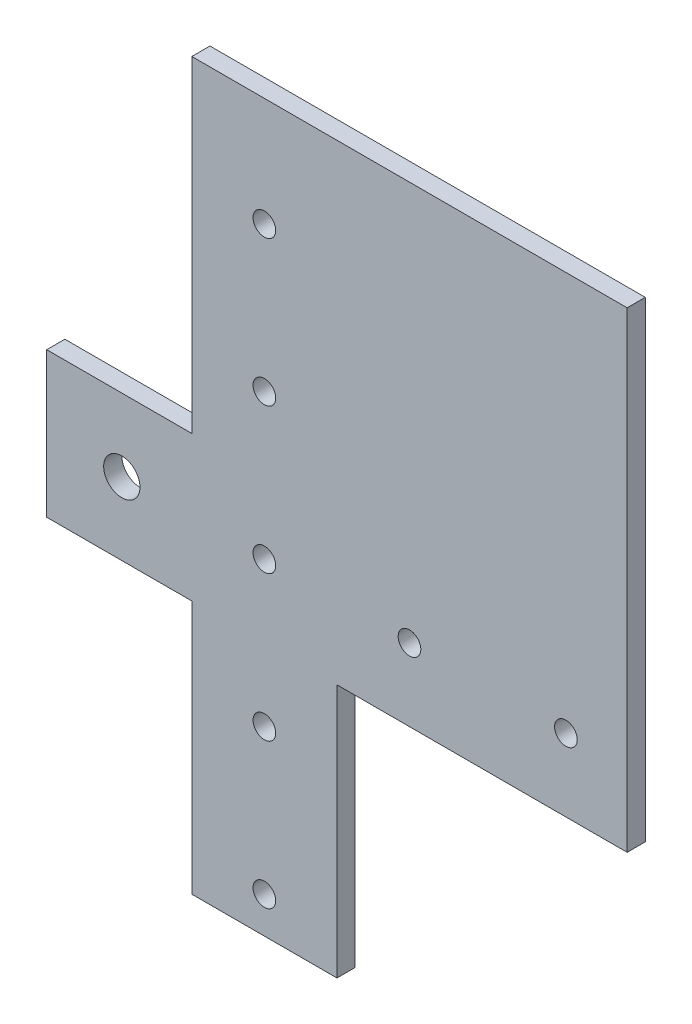
ISO-10303-21;
HEADER;
FILE_DESCRIPTION(('STEP AP214'),'2;1');
FILE_NAME('part.step','',(''),(''),'','','');
FILE_SCHEMA(('AUTOMOTIVE_DESIGN { 1 0 10303 214 1 1 1 1 }'));
ENDSEC;
DATA;
#1=APPLICATION_CONTEXT('core data for automotive mechanical design processes');
#2=APPLICATION_PROTOCOL_DEFINITION('international standard','automotive_design',2000,#1);
#3=PRODUCT_CONTEXT('',#1,'mechanical');
#4=PRODUCT('Part','Part','',(#3));
#5=PRODUCT_RELATED_PRODUCT_CATEGORY('part','',(#4));
#6=PRODUCT_DEFINITION_FORMATION('','',#4);
#7=PRODUCT_DEFINITION_CONTEXT('part definition',#1,'design');
#8=PRODUCT_DEFINITION('design','',#6,#7);
#9=PRODUCT_DEFINITION_SHAPE('','',#8);
#10=(LENGTH_UNIT() NAMED_UNIT(*) SI_UNIT(.MILLI.,.METRE.));
#11=(NAMED_UNIT(*) PLANE_ANGLE_UNIT() SI_UNIT($,.RADIAN.));
#12=(NAMED_UNIT(*) SI_UNIT($,.STERADIAN.) SOLID_ANGLE_UNIT());
#13=UNCERTAINTY_MEASURE_WITH_UNIT(LENGTH_MEASURE(1.E-05),#10,'distance_accuracy_value','');
#14=(GEOMETRIC_REPRESENTATION_CONTEXT(3) GLOBAL_UNCERTAINTY_ASSIGNED_CONTEXT((#13)) GLOBAL_UNIT_ASSIGNED_CONTEXT((#10,
#11,#12)) REPRESENTATION_CONTEXT('',''));
#15=CARTESIAN_POINT('',(0.,0.,0.));
#16=DIRECTION('',(0.,0.,1.));
#17=DIRECTION('',(1.,0.,0.));
#18=AXIS2_PLACEMENT_3D('',#15,#16,#17);
#19=CARTESIAN_POINT('',(0.,-1.78693467336684,3.175));
#20=DIRECTION('',(0.,1.,0.));
#21=DIRECTION('',(0.,0.,1.));
#22=AXIS2_PLACEMENT_3D('',#19,#20,#21);
#23=PLANE('',#22);
#24=DIRECTION('',(1.,0.,0.));
#25=VECTOR('',#24,1.);
#26=CARTESIAN_POINT('',(0.,-1.78693467336684,0.));
#27=LINE('',#26,#25);
#28=CARTESIAN_POINT('',(25.4,-1.78693467336684,0.));
#29=VERTEX_POINT('',#28);
#30=CARTESIAN_POINT('',(50.8,-1.78693467336684,0.));
#31=VERTEX_POINT('',#30);
#32=EDGE_CURVE('E170',#29,#31,#27,.T.);
#33=ORIENTED_EDGE('',*,*,#32,.T.);
#34=DIRECTION('',(0.,0.,-1.));
#35=VECTOR('',#34,1.);
#36=CARTESIAN_POINT('',(50.8,-1.78693467336684,3.175));
#37=LINE('',#36,#35);
#38=CARTESIAN_POINT('',(50.8,-1.78693467336684,3.175));
#39=VERTEX_POINT('',#38);
#40=EDGE_CURVE('E11',#39,#31,#37,.T.);
#41=ORIENTED_EDGE('',*,*,#40,.F.);
#42=DIRECTION('',(1.,0.,0.));
#43=VECTOR('',#42,1.);
#44=CARTESIAN_POINT('',(0.,-1.78693467336684,3.175));
#45=LINE('',#44,#43);
#46=CARTESIAN_POINT('',(25.4,-1.78693467336684,3.175));
#47=VERTEX_POINT('',#46);
#48=EDGE_CURVE('E230',#47,#39,#45,.T.);
#49=ORIENTED_EDGE('',*,*,#48,.F.);
#50=DIRECTION('',(0.,0.,-1.));
#51=VECTOR('',#50,1.);
#52=CARTESIAN_POINT('',(25.4,-1.78693467336684,3.175));
#53=LINE('',#52,#51);
#54=EDGE_CURVE('E52',#47,#29,#53,.T.);
#55=ORIENTED_EDGE('',*,*,#54,.T.);
#56=EDGE_LOOP('',(#33,#41,#49,#55));
#57=FACE_BOUND('',#56,.T.);
#58=ADVANCED_FACE('F35',(#57),#23,.F.);
#59=CARTESIAN_POINT('',(50.8,0.,3.175));
#60=DIRECTION('',(-1.,0.,0.));
#61=DIRECTION('',(0.,0.,1.));
#62=AXIS2_PLACEMENT_3D('',#59,#60,#61);
#63=PLANE('',#62);
#64=DIRECTION('',(0.,1.,0.));
#65=VECTOR('',#64,1.);
#66=CARTESIAN_POINT('',(50.8,0.,0.));
#67=LINE('',#66,#65);
#68=CARTESIAN_POINT('',(50.8,42.6630653266332,0.));
#69=VERTEX_POINT('',#68);
#70=EDGE_CURVE('E172',#31,#69,#67,.T.);
#71=ORIENTED_EDGE('',*,*,#70,.T.);
#72=DIRECTION('',(0.,0.,-1.));
#73=VECTOR('',#72,1.);
#74=CARTESIAN_POINT('',(50.8,42.6630653266332,3.175));
#75=LINE('',#74,#73);
#76=CARTESIAN_POINT('',(50.8,42.6630653266332,3.175));
#77=VERTEX_POINT('',#76);
#78=EDGE_CURVE('E44',#77,#69,#75,.T.);
#79=ORIENTED_EDGE('',*,*,#78,.F.);
#80=DIRECTION('',(0.,1.,0.));
#81=VECTOR('',#80,1.);
#82=CARTESIAN_POINT('',(50.8,0.,3.175));
#83=LINE('',#82,#81);
#84=EDGE_CURVE('E97',#39,#77,#83,.T.);
#85=ORIENTED_EDGE('',*,*,#84,.F.);
#86=ORIENTED_EDGE('',*,*,#40,.T.);
#87=EDGE_LOOP('',(#71,#79,#85,#86));
#88=FACE_BOUND('',#87,.T.);
#89=ADVANCED_FACE('F213',(#88),#63,.F.);
#90=CARTESIAN_POINT('',(0.,42.6630653266332,3.175));
#91=DIRECTION('',(0.,-1.,0.));
#92=DIRECTION('',(0.,0.,-1.));
#93=AXIS2_PLACEMENT_3D('',#90,#91,#92);
#94=PLANE('',#93);
#95=DIRECTION('',(-1.,0.,0.));
#96=VECTOR('',#95,1.);
#97=CARTESIAN_POINT('',(0.,42.6630653266332,0.));
#98=LINE('',#97,#96);
#99=CARTESIAN_POINT('',(101.6,42.6630653266332,0.));
#100=VERTEX_POINT('',#99);
#101=EDGE_CURVE('E175',#100,#69,#98,.T.);
#102=ORIENTED_EDGE('',*,*,#101,.F.);
#103=DIRECTION('',(0.,0.,-1.));
#104=VECTOR('',#103,1.);
#105=CARTESIAN_POINT('',(101.6,42.6630653266332,3.175));
#106=LINE('',#105,#104);
#107=CARTESIAN_POINT('',(101.6,42.6630653266332,3.175));
#108=VERTEX_POINT('',#107);
#109=EDGE_CURVE('E206',#108,#100,#106,.T.);
#110=ORIENTED_EDGE('',*,*,#109,.F.);
#111=DIRECTION('',(-1.,0.,0.));
#112=VECTOR('',#111,1.);
#113=CARTESIAN_POINT('',(0.,42.6630653266332,3.175));
#114=LINE('',#113,#112);
#115=EDGE_CURVE('E212',#108,#77,#114,.T.);
#116=ORIENTED_EDGE('',*,*,#115,.T.);
#117=ORIENTED_EDGE('',*,*,#78,.T.);
#118=EDGE_LOOP('',(#102,#110,#116,#117));
#119=FACE_BOUND('',#118,.T.);
#120=ADVANCED_FACE('F210',(#119),#94,.T.);
#121=CARTESIAN_POINT('',(101.6,0.,3.175));
#122=DIRECTION('',(-1.,0.,0.));
#123=DIRECTION('',(0.,-1.,0.));
#124=AXIS2_PLACEMENT_3D('',#121,#122,#123);
#125=PLANE('',#124);
#126=DIRECTION('',(0.,1.,0.));
#127=VECTOR('',#126,1.);
#128=CARTESIAN_POINT('',(101.6,0.,0.));
#129=LINE('',#128,#127);
#130=CARTESIAN_POINT('',(101.6,125.213065326633,0.));
#131=VERTEX_POINT('',#130);
#132=EDGE_CURVE('E178',#100,#131,#129,.T.);
#133=ORIENTED_EDGE('',*,*,#132,.T.);
#134=DIRECTION('',(0.,0.,-1.));
#135=VECTOR('',#134,1.);
#136=CARTESIAN_POINT('',(101.6,125.213065326633,3.175));
#137=LINE('',#136,#135);
#138=CARTESIAN_POINT('',(101.6,125.213065326633,3.175));
#139=VERTEX_POINT('',#138);
#140=EDGE_CURVE('E204',#139,#131,#137,.T.);
#141=ORIENTED_EDGE('',*,*,#140,.F.);
#142=DIRECTION('',(0.,1.,0.));
#143=VECTOR('',#142,1.);
#144=CARTESIAN_POINT('',(101.6,0.,3.175));
#145=LINE('',#144,#143);
#146=EDGE_CURVE('E225',#108,#139,#145,.T.);
#147=ORIENTED_EDGE('',*,*,#146,.F.);
#148=ORIENTED_EDGE('',*,*,#109,.T.);
#149=EDGE_LOOP('',(#133,#141,#147,#148));
#150=FACE_BOUND('',#149,.T.);
#151=ADVANCED_FACE('F222',(#150),#125,.F.);
#152=CARTESIAN_POINT('',(0.,125.213065326633,3.175));
#153=DIRECTION('',(0.,1.,0.));
#154=DIRECTION('',(0.,0.,1.));
#155=AXIS2_PLACEMENT_3D('',#152,#153,#154);
#156=PLANE('',#155);
#157=DIRECTION('',(1.,0.,0.));
#158=VECTOR('',#157,1.);
#159=CARTESIAN_POINT('',(0.,125.213065326633,0.));
#160=LINE('',#159,#158);
#161=CARTESIAN_POINT('',(25.4,125.213065326633,0.));
#162=VERTEX_POINT('',#161);
#163=EDGE_CURVE('E181',#162,#131,#160,.T.);
#164=ORIENTED_EDGE('',*,*,#163,.F.);
#165=DIRECTION('',(0.,0.,-1.));
#166=VECTOR('',#165,1.);
#167=CARTESIAN_POINT('',(25.4,125.213065326633,3.175));
#168=LINE('',#167,#166);
#169=CARTESIAN_POINT('',(25.4,125.213065326633,3.175));
#170=VERTEX_POINT('',#169);
#171=EDGE_CURVE('E202',#170,#162,#168,.T.);
#172=ORIENTED_EDGE('',*,*,#171,.F.);
#173=DIRECTION('',(1.,0.,0.));
#174=VECTOR('',#173,1.);
#175=CARTESIAN_POINT('',(0.,125.213065326633,3.175));
#176=LINE('',#175,#174);
#177=EDGE_CURVE('E227',#170,#139,#176,.T.);
#178=ORIENTED_EDGE('',*,*,#177,.T.);
#179=ORIENTED_EDGE('',*,*,#140,.T.);
#180=EDGE_LOOP('',(#164,#172,#178,#179));
#181=FACE_BOUND('',#180,.T.);
#182=ADVANCED_FACE('F405',(#181),#156,.T.);
#183=CARTESIAN_POINT('',(25.4,0.,3.175));
#184=DIRECTION('',(1.,0.,0.));
#185=DIRECTION('',(0.,0.,-1.));
#186=AXIS2_PLACEMENT_3D('',#183,#184,#185);
#187=PLANE('',#186);
#188=DIRECTION('',(0.,-1.,0.));
#189=VECTOR('',#188,1.);
#190=CARTESIAN_POINT('',(25.4,0.,0.));
#191=LINE('',#190,#189);
#192=CARTESIAN_POINT('',(25.4,68.0630653266332,0.));
#193=VERTEX_POINT('',#192);
#194=EDGE_CURVE('E184',#162,#193,#191,.T.);
#195=ORIENTED_EDGE('',*,*,#194,.T.);
#196=DIRECTION('',(0.,0.,-1.));
#197=VECTOR('',#196,1.);
#198=CARTESIAN_POINT('',(25.4,68.0630653266332,3.175));
#199=LINE('',#198,#197);
#200=CARTESIAN_POINT('',(25.4,68.0630653266332,3.175));
#201=VERTEX_POINT('',#200);
#202=EDGE_CURVE('E200',#201,#193,#199,.T.);
#203=ORIENTED_EDGE('',*,*,#202,.F.);
#204=DIRECTION('',(0.,-1.,0.));
#205=VECTOR('',#204,1.);
#206=CARTESIAN_POINT('',(25.4,0.,3.175));
#207=LINE('',#206,#205);
#208=EDGE_CURVE('E141',#170,#201,#207,.T.);
#209=ORIENTED_EDGE('',*,*,#208,.F.);
#210=ORIENTED_EDGE('',*,*,#171,.T.);
#211=EDGE_LOOP('',(#195,#203,#209,#210));
#212=FACE_BOUND('',#211,.T.);
#213=ADVANCED_FACE('F237',(#212),#187,.F.);
#214=CARTESIAN_POINT('',(0.,68.0630653266332,3.175));
#215=DIRECTION('',(0.,1.,0.));
#216=DIRECTION('',(0.,0.,1.));
#217=AXIS2_PLACEMENT_3D('',#214,#215,#216);
#218=PLANE('',#217);
#219=DIRECTION('',(1.,0.,0.));
#220=VECTOR('',#219,1.);
#221=CARTESIAN_POINT('',(0.,68.0630653266332,0.));
#222=LINE('',#221,#220);
#223=CARTESIAN_POINT('',(0.,68.0630653266332,0.));
#224=VERTEX_POINT('',#223);
#225=EDGE_CURVE('E187',#224,#193,#222,.T.);
#226=ORIENTED_EDGE('',*,*,#225,.F.);
#227=DIRECTION('',(0.,0.,-1.));
#228=VECTOR('',#227,1.);
#229=CARTESIAN_POINT('',(0.,68.0630653266332,3.175));
#230=LINE('',#229,#228);
#231=CARTESIAN_POINT('',(0.,68.0630653266332,3.175));
#232=VERTEX_POINT('',#231);
#233=EDGE_CURVE('E128',#232,#224,#230,.T.);
#234=ORIENTED_EDGE('',*,*,#233,.F.);
#235=DIRECTION('',(1.,0.,0.));
#236=VECTOR('',#235,1.);
#237=CARTESIAN_POINT('',(0.,68.0630653266332,3.175));
#238=LINE('',#237,#236);
#239=EDGE_CURVE('E139',#232,#201,#238,.T.);
#240=ORIENTED_EDGE('',*,*,#239,.T.);
#241=ORIENTED_EDGE('',*,*,#202,.T.);
#242=EDGE_LOOP('',(#226,#234,#240,#241));
#243=FACE_BOUND('',#242,.T.);
#244=ADVANCED_FACE('F240',(#243),#218,.T.);
#245=CARTESIAN_POINT('',(0.,0.,3.175));
#246=DIRECTION('',(-1.,0.,0.));
#247=DIRECTION('',(0.,-1.,0.));
#248=AXIS2_PLACEMENT_3D('',#245,#246,#247);
#249=PLANE('',#248);
#250=DIRECTION('',(0.,1.,0.));
#251=VECTOR('',#250,1.);
#252=CARTESIAN_POINT('',(0.,0.,0.));
#253=LINE('',#252,#251);
#254=CARTESIAN_POINT('',(0.,42.6630653266332,0.));
#255=VERTEX_POINT('',#254);
#256=EDGE_CURVE('E125',#255,#224,#253,.T.);
#257=ORIENTED_EDGE('',*,*,#256,.F.);
#258=DIRECTION('',(0.,0.,-1.));
#259=VECTOR('',#258,1.);
#260=CARTESIAN_POINT('',(0.,42.6630653266332,3.175));
#261=LINE('',#260,#259);
#262=CARTESIAN_POINT('',(0.,42.6630653266332,3.175));
#263=VERTEX_POINT('',#262);
#264=EDGE_CURVE('E119',#263,#255,#261,.T.);
#265=ORIENTED_EDGE('',*,*,#264,.F.);
#266=DIRECTION('',(0.,1.,0.));
#267=VECTOR('',#266,1.);
#268=CARTESIAN_POINT('',(0.,0.,3.175));
#269=LINE('',#268,#267);
#270=EDGE_CURVE('E123',#263,#232,#269,.T.);
#271=ORIENTED_EDGE('',*,*,#270,.T.);
#272=ORIENTED_EDGE('',*,*,#233,.T.);
#273=EDGE_LOOP('',(#257,#265,#271,#272));
#274=FACE_BOUND('',#273,.T.);
#275=ADVANCED_FACE('F121',(#274),#249,.T.);
#276=CARTESIAN_POINT('',(0.,42.6630653266332,3.175));
#277=DIRECTION('',(0.,1.,0.));
#278=DIRECTION('',(0.,0.,1.));
#279=AXIS2_PLACEMENT_3D('',#276,#277,#278);
#280=PLANE('',#279);
#281=DIRECTION('',(1.,0.,0.));
#282=VECTOR('',#281,1.);
#283=CARTESIAN_POINT('',(0.,42.6630653266332,0.));
#284=LINE('',#283,#282);
#285=CARTESIAN_POINT('',(25.4,42.6630653266332,0.));
#286=VERTEX_POINT('',#285);
#287=EDGE_CURVE('E191',#255,#286,#284,.T.);
#288=ORIENTED_EDGE('',*,*,#287,.T.);
#289=DIRECTION('',(0.,0.,-1.));
#290=VECTOR('',#289,1.);
#291=CARTESIAN_POINT('',(25.4,42.6630653266332,3.175));
#292=LINE('',#291,#290);
#293=CARTESIAN_POINT('',(25.4,42.6630653266332,3.175));
#294=VERTEX_POINT('',#293);
#295=EDGE_CURVE('E85',#294,#286,#292,.T.);
#296=ORIENTED_EDGE('',*,*,#295,.F.);
#297=DIRECTION('',(1.,0.,0.));
#298=VECTOR('',#297,1.);
#299=CARTESIAN_POINT('',(0.,42.6630653266332,3.175));
#300=LINE('',#299,#298);
#301=EDGE_CURVE('E130',#263,#294,#300,.T.);
#302=ORIENTED_EDGE('',*,*,#301,.F.);
#303=ORIENTED_EDGE('',*,*,#264,.T.);
#304=EDGE_LOOP('',(#288,#296,#302,#303));
#305=FACE_BOUND('',#304,.T.);
#306=ADVANCED_FACE('F131',(#305),#280,.F.);
#307=CARTESIAN_POINT('',(38.1,106.163065326633,3.175));
#308=DIRECTION('',(0.,0.,-1.));
#309=DIRECTION('',(-1.,0.,0.));
#310=AXIS2_PLACEMENT_3D('',#307,#308,#309);
#311=CYLINDRICAL_SURFACE('',#310,1.98437499999999);
#312=CARTESIAN_POINT('',(38.1,106.163065326633,3.175));
#313=DIRECTION('',(0.,0.,1.));
#314=DIRECTION('',(1.,0.,0.));
#315=AXIS2_PLACEMENT_3D('',#312,#313,#314);
#316=CIRCLE('',#315,1.98437499999999);
#317=CARTESIAN_POINT('',(40.084375,106.163065326633,3.175));
#318=VERTEX_POINT('',#317);
#319=EDGE_CURVE('E465',#318,#318,#316,.T.);
#320=ORIENTED_EDGE('',*,*,#319,.T.);
#321=EDGE_LOOP('',(#320));
#322=FACE_BOUND('',#321,.T.);
#323=CARTESIAN_POINT('',(38.1,106.163065326633,0.));
#324=DIRECTION('',(0.,0.,1.));
#325=DIRECTION('',(1.,0.,0.));
#326=AXIS2_PLACEMENT_3D('',#323,#324,#325);
#327=CIRCLE('',#326,1.98437499999999);
#328=CARTESIAN_POINT('',(40.084375,106.163065326633,0.));
#329=VERTEX_POINT('',#328);
#330=EDGE_CURVE('E167',#329,#329,#327,.T.);
#331=ORIENTED_EDGE('',*,*,#330,.F.);
#332=EDGE_LOOP('',(#331));
#333=FACE_BOUND('',#332,.T.);
#334=ADVANCED_FACE('F262',(#322,#333),#311,.F.);
#335=CARTESIAN_POINT('',(38.1,80.7630653266332,3.175));
#336=DIRECTION('',(0.,0.,-1.));
#337=DIRECTION('',(-1.,0.,0.));
#338=AXIS2_PLACEMENT_3D('',#335,#336,#337);
#339=CYLINDRICAL_SURFACE('',#338,1.98437499999999);
#340=CARTESIAN_POINT('',(38.1,80.7630653266332,3.175));
#341=DIRECTION('',(0.,0.,1.));
#342=DIRECTION('',(1.,0.,0.));
#343=AXIS2_PLACEMENT_3D('',#340,#341,#342);
#344=CIRCLE('',#343,1.98437499999999);
#345=CARTESIAN_POINT('',(40.084375,80.7630653266332,3.175));
#346=VERTEX_POINT('',#345);
#347=EDGE_CURVE('E462',#346,#346,#344,.T.);
#348=ORIENTED_EDGE('',*,*,#347,.T.);
#349=EDGE_LOOP('',(#348));
#350=FACE_BOUND('',#349,.T.);
#351=CARTESIAN_POINT('',(38.1,80.7630653266332,0.));
#352=DIRECTION('',(0.,0.,1.));
#353=DIRECTION('',(1.,0.,0.));
#354=AXIS2_PLACEMENT_3D('',#351,#352,#353);
#355=CIRCLE('',#354,1.98437499999999);
#356=CARTESIAN_POINT('',(40.084375,80.7630653266332,0.));
#357=VERTEX_POINT('',#356);
#358=EDGE_CURVE('E164',#357,#357,#355,.T.);
#359=ORIENTED_EDGE('',*,*,#358,.F.);
#360=EDGE_LOOP('',(#359));
#361=FACE_BOUND('',#360,.T.);
#362=ADVANCED_FACE('F265',(#350,#361),#339,.F.);
#363=CARTESIAN_POINT('',(38.1,55.3630653266332,3.175));
#364=DIRECTION('',(0.,0.,-1.));
#365=DIRECTION('',(-1.,0.,0.));
#366=AXIS2_PLACEMENT_3D('',#363,#364,#365);
#367=CYLINDRICAL_SURFACE('',#366,1.98437499999999);
#368=CARTESIAN_POINT('',(38.1,55.3630653266332,3.175));
#369=DIRECTION('',(0.,0.,1.));
#370=DIRECTION('',(1.,0.,0.));
#371=AXIS2_PLACEMENT_3D('',#368,#369,#370);
#372=CIRCLE('',#371,1.98437499999999);
#373=CARTESIAN_POINT('',(40.084375,55.3630653266332,3.175));
#374=VERTEX_POINT('',#373);
#375=EDGE_CURVE('E459',#374,#374,#372,.T.);
#376=ORIENTED_EDGE('',*,*,#375,.T.);
#377=EDGE_LOOP('',(#376));
#378=FACE_BOUND('',#377,.T.);
#379=CARTESIAN_POINT('',(38.1,55.3630653266332,0.));
#380=DIRECTION('',(0.,0.,1.));
#381=DIRECTION('',(1.,0.,0.));
#382=AXIS2_PLACEMENT_3D('',#379,#380,#381);
#383=CIRCLE('',#382,1.98437499999999);
#384=CARTESIAN_POINT('',(40.084375,55.3630653266332,0.));
#385=VERTEX_POINT('',#384);
#386=EDGE_CURVE('E161',#385,#385,#383,.T.);
#387=ORIENTED_EDGE('',*,*,#386,.F.);
#388=EDGE_LOOP('',(#387));
#389=FACE_BOUND('',#388,.T.);
#390=ADVANCED_FACE('F269',(#378,#389),#367,.F.);
#391=CARTESIAN_POINT('',(38.1,29.9630653266332,3.175));
#392=DIRECTION('',(0.,0.,-1.));
#393=DIRECTION('',(-1.,0.,0.));
#394=AXIS2_PLACEMENT_3D('',#391,#392,#393);
#395=CYLINDRICAL_SURFACE('',#394,1.98437499999999);
#396=CARTESIAN_POINT('',(38.1,29.9630653266332,3.175));
#397=DIRECTION('',(0.,0.,1.));
#398=DIRECTION('',(1.,0.,0.));
#399=AXIS2_PLACEMENT_3D('',#396,#397,#398);
#400=CIRCLE('',#399,1.98437499999999);
#401=CARTESIAN_POINT('',(40.084375,29.9630653266332,3.175));
#402=VERTEX_POINT('',#401);
#403=EDGE_CURVE('E456',#402,#402,#400,.T.);
#404=ORIENTED_EDGE('',*,*,#403,.T.);
#405=EDGE_LOOP('',(#404));
#406=FACE_BOUND('',#405,.T.);
#407=CARTESIAN_POINT('',(38.1,29.9630653266332,0.));
#408=DIRECTION('',(0.,0.,1.));
#409=DIRECTION('',(1.,0.,0.));
#410=AXIS2_PLACEMENT_3D('',#407,#408,#409);
#411=CIRCLE('',#410,1.98437499999999);
#412=CARTESIAN_POINT('',(40.084375,29.9630653266332,0.));
#413=VERTEX_POINT('',#412);
#414=EDGE_CURVE('E158',#413,#413,#411,.T.);
#415=ORIENTED_EDGE('',*,*,#414,.F.);
#416=EDGE_LOOP('',(#415));
#417=FACE_BOUND('',#416,.T.);
#418=ADVANCED_FACE('F273',(#406,#417),#395,.F.);
#419=CARTESIAN_POINT('',(38.1,4.56306532663316,3.175));
#420=DIRECTION('',(0.,0.,-1.));
#421=DIRECTION('',(-1.,0.,0.));
#422=AXIS2_PLACEMENT_3D('',#419,#420,#421);
#423=CYLINDRICAL_SURFACE('',#422,1.984375);
#424=CARTESIAN_POINT('',(38.1,4.56306532663316,3.175));
#425=DIRECTION('',(0.,0.,1.));
#426=DIRECTION('',(1.,0.,0.));
#427=AXIS2_PLACEMENT_3D('',#424,#425,#426);
#428=CIRCLE('',#427,1.984375);
#429=CARTESIAN_POINT('',(40.084375,4.56306532663316,3.175));
#430=VERTEX_POINT('',#429);
#431=EDGE_CURVE('E449',#430,#430,#428,.T.);
#432=ORIENTED_EDGE('',*,*,#431,.T.);
#433=EDGE_LOOP('',(#432));
#434=FACE_BOUND('',#433,.T.);
#435=CARTESIAN_POINT('',(38.1,4.56306532663316,0.));
#436=DIRECTION('',(0.,0.,1.));
#437=DIRECTION('',(1.,0.,0.));
#438=AXIS2_PLACEMENT_3D('',#435,#436,#437);
#439=CIRCLE('',#438,1.984375);
#440=CARTESIAN_POINT('',(40.084375,4.56306532663316,0.));
#441=VERTEX_POINT('',#440);
#442=EDGE_CURVE('E155',#441,#441,#439,.T.);
#443=ORIENTED_EDGE('',*,*,#442,.F.);
#444=EDGE_LOOP('',(#443));
#445=FACE_BOUND('',#444,.T.);
#446=ADVANCED_FACE('F277',(#434,#445),#423,.F.);
#447=CARTESIAN_POINT('',(63.5,55.3630653266332,3.175));
#448=DIRECTION('',(0.,0.,-1.));
#449=DIRECTION('',(-1.,0.,0.));
#450=AXIS2_PLACEMENT_3D('',#447,#448,#449);
#451=CYLINDRICAL_SURFACE('',#450,1.98437499999999);
#452=CARTESIAN_POINT('',(63.5,55.3630653266332,3.175));
#453=DIRECTION('',(0.,0.,1.));
#454=DIRECTION('',(1.,0.,0.));
#455=AXIS2_PLACEMENT_3D('',#452,#453,#454);
#456=CIRCLE('',#455,1.98437499999999);
#457=CARTESIAN_POINT('',(65.484375,55.3630653266332,3.175));
#458=VERTEX_POINT('',#457);
#459=EDGE_CURVE('E446',#458,#458,#456,.T.);
#460=ORIENTED_EDGE('',*,*,#459,.T.);
#461=EDGE_LOOP('',(#460));
#462=FACE_BOUND('',#461,.T.);
#463=CARTESIAN_POINT('',(63.5,55.3630653266332,0.));
#464=DIRECTION('',(0.,0.,1.));
#465=DIRECTION('',(1.,0.,0.));
#466=AXIS2_PLACEMENT_3D('',#463,#464,#465);
#467=CIRCLE('',#466,1.98437499999999);
#468=CARTESIAN_POINT('',(65.484375,55.3630653266332,0.));
#469=VERTEX_POINT('',#468);
#470=EDGE_CURVE('E152',#469,#469,#467,.T.);
#471=ORIENTED_EDGE('',*,*,#470,.F.);
#472=EDGE_LOOP('',(#471));
#473=FACE_BOUND('',#472,.T.);
#474=ADVANCED_FACE('F281',(#462,#473),#451,.F.);
#475=CARTESIAN_POINT('',(90.884375,55.3630653266332,3.175));
#476=DIRECTION('',(0.,0.,-1.));
#477=DIRECTION('',(-1.,0.,0.));
#478=AXIS2_PLACEMENT_3D('',#475,#476,#477);
#479=CYLINDRICAL_SURFACE('',#478,1.98437499999999);
#480=CARTESIAN_POINT('',(90.884375,55.3630653266332,3.175));
#481=DIRECTION('',(0.,0.,1.));
#482=DIRECTION('',(1.,0.,0.));
#483=AXIS2_PLACEMENT_3D('',#480,#481,#482);
#484=CIRCLE('',#483,1.98437499999999);
#485=CARTESIAN_POINT('',(92.86875,55.3630653266332,3.175));
#486=VERTEX_POINT('',#485);
#487=EDGE_CURVE('E292',#486,#486,#484,.T.);
#488=ORIENTED_EDGE('',*,*,#487,.T.);
#489=EDGE_LOOP('',(#488));
#490=FACE_BOUND('',#489,.T.);
#491=CARTESIAN_POINT('',(90.884375,55.3630653266332,0.));
#492=DIRECTION('',(0.,0.,1.));
#493=DIRECTION('',(1.,0.,0.));
#494=AXIS2_PLACEMENT_3D('',#491,#492,#493);
#495=CIRCLE('',#494,1.98437499999999);
#496=CARTESIAN_POINT('',(92.86875,55.3630653266332,0.));
#497=VERTEX_POINT('',#496);
#498=EDGE_CURVE('E149',#497,#497,#495,.T.);
#499=ORIENTED_EDGE('',*,*,#498,.F.);
#500=EDGE_LOOP('',(#499));
#501=FACE_BOUND('',#500,.T.);
#502=ADVANCED_FACE('F250',(#490,#501),#479,.F.);
#503=CARTESIAN_POINT('',(13.1435536111557,55.3630653266332,3.175));
#504=DIRECTION('',(0.,0.,-1.));
#505=DIRECTION('',(-1.,0.,0.));
#506=AXIS2_PLACEMENT_3D('',#503,#504,#505);
#507=CYLINDRICAL_SURFACE('',#506,3.175);
#508=CARTESIAN_POINT('',(13.1435536111557,55.3630653266332,3.175));
#509=DIRECTION('',(0.,0.,1.));
#510=DIRECTION('',(1.,0.,0.));
#511=AXIS2_PLACEMENT_3D('',#508,#509,#510);
#512=CIRCLE('',#511,3.175);
#513=CARTESIAN_POINT('',(16.3185536111557,55.3630653266332,3.175));
#514=VERTEX_POINT('',#513);
#515=EDGE_CURVE('E196',#514,#514,#512,.T.);
#516=ORIENTED_EDGE('',*,*,#515,.T.);
#517=EDGE_LOOP('',(#516));
#518=FACE_BOUND('',#517,.T.);
#519=CARTESIAN_POINT('',(13.1435536111557,55.3630653266332,0.));
#520=DIRECTION('',(0.,0.,1.));
#521=DIRECTION('',(1.,0.,0.));
#522=AXIS2_PLACEMENT_3D('',#519,#520,#521);
#523=CIRCLE('',#522,3.175);
#524=CARTESIAN_POINT('',(16.3185536111557,55.3630653266332,0.));
#525=VERTEX_POINT('',#524);
#526=EDGE_CURVE('E146',#525,#525,#523,.T.);
#527=ORIENTED_EDGE('',*,*,#526,.F.);
#528=EDGE_LOOP('',(#527));
#529=FACE_BOUND('',#528,.T.);
#530=ADVANCED_FACE('F37',(#518,#529),#507,.F.);
#531=CARTESIAN_POINT('',(25.4,0.,3.175));
#532=DIRECTION('',(-1.,0.,0.));
#533=DIRECTION('',(0.,0.,1.));
#534=AXIS2_PLACEMENT_3D('',#531,#532,#533);
#535=PLANE('',#534);
#536=DIRECTION('',(0.,1.,0.));
#537=VECTOR('',#536,1.);
#538=CARTESIAN_POINT('',(25.4,0.,0.));
#539=LINE('',#538,#537);
#540=EDGE_CURVE('E193',#29,#286,#539,.T.);
#541=ORIENTED_EDGE('',*,*,#540,.F.);
#542=ORIENTED_EDGE('',*,*,#54,.F.);
#543=DIRECTION('',(0.,1.,0.));
#544=VECTOR('',#543,1.);
#545=CARTESIAN_POINT('',(25.4,0.,3.175));
#546=LINE('',#545,#544);
#547=EDGE_CURVE('E134',#47,#294,#546,.T.);
#548=ORIENTED_EDGE('',*,*,#547,.T.);
#549=ORIENTED_EDGE('',*,*,#295,.T.);
#550=EDGE_LOOP('',(#541,#542,#548,#549));
#551=FACE_BOUND('',#550,.T.);
#552=ADVANCED_FACE('F241',(#551),#535,.T.);
#553=CARTESIAN_POINT('',(0.,0.,3.175));
#554=DIRECTION('',(0.,0.,1.));
#555=DIRECTION('',(1.,0.,0.));
#556=AXIS2_PLACEMENT_3D('',#553,#554,#555);
#557=PLANE('',#556);
#558=ORIENTED_EDGE('',*,*,#515,.F.);
#559=EDGE_LOOP('',(#558));
#560=FACE_BOUND('',#559,.T.);
#561=ORIENTED_EDGE('',*,*,#487,.F.);
#562=EDGE_LOOP('',(#561));
#563=FACE_BOUND('',#562,.T.);
#564=ORIENTED_EDGE('',*,*,#459,.F.);
#565=EDGE_LOOP('',(#564));
#566=FACE_BOUND('',#565,.T.);
#567=ORIENTED_EDGE('',*,*,#431,.F.);
#568=EDGE_LOOP('',(#567));
#569=FACE_BOUND('',#568,.T.);
#570=ORIENTED_EDGE('',*,*,#403,.F.);
#571=EDGE_LOOP('',(#570));
#572=FACE_BOUND('',#571,.T.);
#573=ORIENTED_EDGE('',*,*,#375,.F.);
#574=EDGE_LOOP('',(#573));
#575=FACE_BOUND('',#574,.T.);
#576=ORIENTED_EDGE('',*,*,#347,.F.);
#577=EDGE_LOOP('',(#576));
#578=FACE_BOUND('',#577,.T.);
#579=ORIENTED_EDGE('',*,*,#319,.F.);
#580=EDGE_LOOP('',(#579));
#581=FACE_BOUND('',#580,.T.);
#582=ORIENTED_EDGE('',*,*,#48,.T.);
#583=ORIENTED_EDGE('',*,*,#84,.T.);
#584=ORIENTED_EDGE('',*,*,#115,.F.);
#585=ORIENTED_EDGE('',*,*,#146,.T.);
#586=ORIENTED_EDGE('',*,*,#177,.F.);
#587=ORIENTED_EDGE('',*,*,#208,.T.);
#588=ORIENTED_EDGE('',*,*,#239,.F.);
#589=ORIENTED_EDGE('',*,*,#270,.F.);
#590=ORIENTED_EDGE('',*,*,#301,.T.);
#591=ORIENTED_EDGE('',*,*,#547,.F.);
#592=EDGE_LOOP('',(#582,#583,#584,#585,#586,#587,#588,#589,#590,#591));
#593=FACE_BOUND('',#592,.T.);
#594=ADVANCED_FACE('F137',(#560,#563,#566,#569,#572,#575,#578,#581,#593),#557,.T.);
#595=CARTESIAN_POINT('',(0.,0.,0.));
#596=DIRECTION('',(0.,0.,1.));
#597=DIRECTION('',(1.,0.,0.));
#598=AXIS2_PLACEMENT_3D('',#595,#596,#597);
#599=PLANE('',#598);
#600=ORIENTED_EDGE('',*,*,#526,.T.);
#601=EDGE_LOOP('',(#600));
#602=FACE_BOUND('',#601,.T.);
#603=ORIENTED_EDGE('',*,*,#498,.T.);
#604=EDGE_LOOP('',(#603));
#605=FACE_BOUND('',#604,.T.);
#606=ORIENTED_EDGE('',*,*,#470,.T.);
#607=EDGE_LOOP('',(#606));
#608=FACE_BOUND('',#607,.T.);
#609=ORIENTED_EDGE('',*,*,#442,.T.);
#610=EDGE_LOOP('',(#609));
#611=FACE_BOUND('',#610,.T.);
#612=ORIENTED_EDGE('',*,*,#414,.T.);
#613=EDGE_LOOP('',(#612));
#614=FACE_BOUND('',#613,.T.);
#615=ORIENTED_EDGE('',*,*,#386,.T.);
#616=EDGE_LOOP('',(#615));
#617=FACE_BOUND('',#616,.T.);
#618=ORIENTED_EDGE('',*,*,#358,.T.);
#619=EDGE_LOOP('',(#618));
#620=FACE_BOUND('',#619,.T.);
#621=ORIENTED_EDGE('',*,*,#330,.T.);
#622=EDGE_LOOP('',(#621));
#623=FACE_BOUND('',#622,.T.);
#624=ORIENTED_EDGE('',*,*,#32,.F.);
#625=ORIENTED_EDGE('',*,*,#540,.T.);
#626=ORIENTED_EDGE('',*,*,#287,.F.);
#627=ORIENTED_EDGE('',*,*,#256,.T.);
#628=ORIENTED_EDGE('',*,*,#225,.T.);
#629=ORIENTED_EDGE('',*,*,#194,.F.);
#630=ORIENTED_EDGE('',*,*,#163,.T.);
#631=ORIENTED_EDGE('',*,*,#132,.F.);
#632=ORIENTED_EDGE('',*,*,#101,.T.);
#633=ORIENTED_EDGE('',*,*,#70,.F.);
#634=EDGE_LOOP('',(#624,#625,#626,#627,#628,#629,#630,#631,#632,#633));
#635=FACE_BOUND('',#634,.T.);
#636=ADVANCED_FACE('F217',(#602,#605,#608,#611,#614,#617,#620,#623,#635),#599,.F.);
#637=CLOSED_SHELL('',(#58,#89,#120,#151,#182,#213,#244,#275,#306,#334,#362,#390,#418,#446,#474,
#502,#530,#552,#594,#636));
#638=MANIFOLD_SOLID_BREP('B2',#637);
#639=ADVANCED_BREP_SHAPE_REPRESENTATION('',(#18,#638),#14);
#640=SHAPE_DEFINITION_REPRESENTATION(#9,#639);
ENDSEC;
END-ISO-10303-21;
